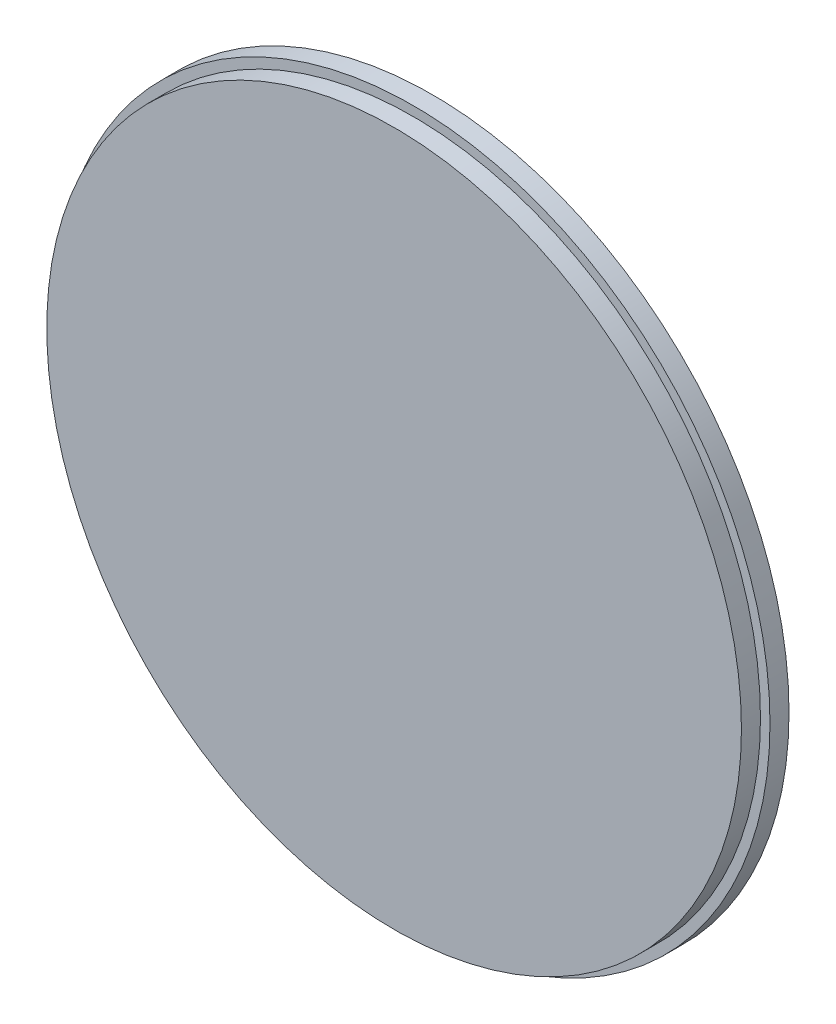
ISO-10303-21;
HEADER;
FILE_DESCRIPTION(('STEP AP214'),'2;1');
FILE_NAME('part.step','',(''),(''),'','','');
FILE_SCHEMA(('AUTOMOTIVE_DESIGN { 1 0 10303 214 1 1 1 1 }'));
ENDSEC;
DATA;
#1=APPLICATION_CONTEXT('core data for automotive mechanical design processes');
#2=APPLICATION_PROTOCOL_DEFINITION('international standard','automotive_design',2000,#1);
#3=PRODUCT_CONTEXT('',#1,'mechanical');
#4=PRODUCT('Part','Part','',(#3));
#5=PRODUCT_RELATED_PRODUCT_CATEGORY('part','',(#4));
#6=PRODUCT_DEFINITION_FORMATION('','',#4);
#7=PRODUCT_DEFINITION_CONTEXT('part definition',#1,'design');
#8=PRODUCT_DEFINITION('design','',#6,#7);
#9=PRODUCT_DEFINITION_SHAPE('','',#8);
#10=(LENGTH_UNIT() NAMED_UNIT(*) SI_UNIT(.MILLI.,.METRE.));
#11=(NAMED_UNIT(*) PLANE_ANGLE_UNIT() SI_UNIT($,.RADIAN.));
#12=(NAMED_UNIT(*) SI_UNIT($,.STERADIAN.) SOLID_ANGLE_UNIT());
#13=UNCERTAINTY_MEASURE_WITH_UNIT(LENGTH_MEASURE(1.E-05),#10,'distance_accuracy_value','');
#14=(GEOMETRIC_REPRESENTATION_CONTEXT(3) GLOBAL_UNCERTAINTY_ASSIGNED_CONTEXT((#13)) GLOBAL_UNIT_ASSIGNED_CONTEXT((#10,
#11,#12)) REPRESENTATION_CONTEXT('',''));
#15=CARTESIAN_POINT('',(0.,0.,0.));
#16=DIRECTION('',(0.,0.,1.));
#17=DIRECTION('',(1.,0.,0.));
#18=AXIS2_PLACEMENT_3D('',#15,#16,#17);
#19=CARTESIAN_POINT('',(0.,0.,1.));
#20=DIRECTION('',(0.,0.,-1.));
#21=DIRECTION('',(-1.,0.,0.));
#22=AXIS2_PLACEMENT_3D('',#19,#20,#21);
#23=CYLINDRICAL_SURFACE('',#22,18.75);
#24=CARTESIAN_POINT('',(0.,0.,1.));
#25=DIRECTION('',(0.,0.,1.));
#26=DIRECTION('',(1.,0.,0.));
#27=AXIS2_PLACEMENT_3D('',#24,#25,#26);
#28=CIRCLE('',#27,18.75);
#29=CARTESIAN_POINT('',(18.75,0.,1.));
#30=VERTEX_POINT('',#29);
#31=EDGE_CURVE('E38',#30,#30,#28,.T.);
#32=ORIENTED_EDGE('',*,*,#31,.F.);
#33=EDGE_LOOP('',(#32));
#34=FACE_BOUND('',#33,.T.);
#35=CARTESIAN_POINT('',(0.,0.,0.));
#36=DIRECTION('',(0.,0.,1.));
#37=DIRECTION('',(1.,0.,0.));
#38=AXIS2_PLACEMENT_3D('',#35,#36,#37);
#39=CIRCLE('',#38,18.75);
#40=CARTESIAN_POINT('',(18.75,0.,0.));
#41=VERTEX_POINT('',#40);
#42=EDGE_CURVE('E34',#41,#41,#39,.T.);
#43=ORIENTED_EDGE('',*,*,#42,.T.);
#44=EDGE_LOOP('',(#43));
#45=FACE_BOUND('',#44,.T.);
#46=ADVANCED_FACE('F31',(#34,#45),#23,.T.);
#47=CARTESIAN_POINT('',(0.,0.,1.));
#48=DIRECTION('',(0.,0.,1.));
#49=DIRECTION('',(1.,0.,0.));
#50=AXIS2_PLACEMENT_3D('',#47,#48,#49);
#51=PLANE('',#50);
#52=CARTESIAN_POINT('',(0.,0.,1.));
#53=DIRECTION('',(0.,0.,1.));
#54=DIRECTION('',(1.,0.,0.));
#55=AXIS2_PLACEMENT_3D('',#52,#53,#54);
#56=CIRCLE('',#55,18.25);
#57=CARTESIAN_POINT('',(18.25,0.,1.));
#58=VERTEX_POINT('',#57);
#59=EDGE_CURVE('E10',#58,#58,#56,.T.);
#60=ORIENTED_EDGE('',*,*,#59,.F.);
#61=EDGE_LOOP('',(#60));
#62=FACE_BOUND('',#61,.T.);
#63=ORIENTED_EDGE('',*,*,#31,.T.);
#64=EDGE_LOOP('',(#63));
#65=FACE_BOUND('',#64,.T.);
#66=ADVANCED_FACE('F55',(#62,#65),#51,.T.);
#67=CARTESIAN_POINT('',(0.,0.,0.));
#68=DIRECTION('',(0.,0.,1.));
#69=DIRECTION('',(1.,0.,0.));
#70=AXIS2_PLACEMENT_3D('',#67,#68,#69);
#71=PLANE('',#70);
#72=ORIENTED_EDGE('',*,*,#42,.F.);
#73=EDGE_LOOP('',(#72));
#74=FACE_BOUND('',#73,.T.);
#75=ADVANCED_FACE('F52',(#74),#71,.F.);
#76=CARTESIAN_POINT('',(0.,0.,2.));
#77=DIRECTION('',(0.,0.,-1.));
#78=DIRECTION('',(-1.,0.,0.));
#79=AXIS2_PLACEMENT_3D('',#76,#77,#78);
#80=CYLINDRICAL_SURFACE('',#79,18.25);
#81=CARTESIAN_POINT('',(0.,0.,2.));
#82=DIRECTION('',(0.,0.,1.));
#83=DIRECTION('',(1.,0.,0.));
#84=AXIS2_PLACEMENT_3D('',#81,#82,#83);
#85=CIRCLE('',#84,18.25);
#86=CARTESIAN_POINT('',(18.25,0.,2.));
#87=VERTEX_POINT('',#86);
#88=EDGE_CURVE('E44',#87,#87,#85,.T.);
#89=ORIENTED_EDGE('',*,*,#88,.F.);
#90=EDGE_LOOP('',(#89));
#91=FACE_BOUND('',#90,.T.);
#92=ORIENTED_EDGE('',*,*,#59,.T.);
#93=EDGE_LOOP('',(#92));
#94=FACE_BOUND('',#93,.T.);
#95=ADVANCED_FACE('F54',(#91,#94),#80,.T.);
#96=CARTESIAN_POINT('',(0.,0.,2.));
#97=DIRECTION('',(0.,0.,1.));
#98=DIRECTION('',(1.,0.,0.));
#99=AXIS2_PLACEMENT_3D('',#96,#97,#98);
#100=PLANE('',#99);
#101=ORIENTED_EDGE('',*,*,#88,.T.);
#102=EDGE_LOOP('',(#101));
#103=FACE_BOUND('',#102,.T.);
#104=ADVANCED_FACE('F60',(#103),#100,.T.);
#105=CLOSED_SHELL('',(#46,#66,#75,#95,#104));
#106=MANIFOLD_SOLID_BREP('B2',#105);
#107=ADVANCED_BREP_SHAPE_REPRESENTATION('',(#18,#106),#14);
#108=SHAPE_DEFINITION_REPRESENTATION(#9,#107);
ENDSEC;
END-ISO-10303-21;
